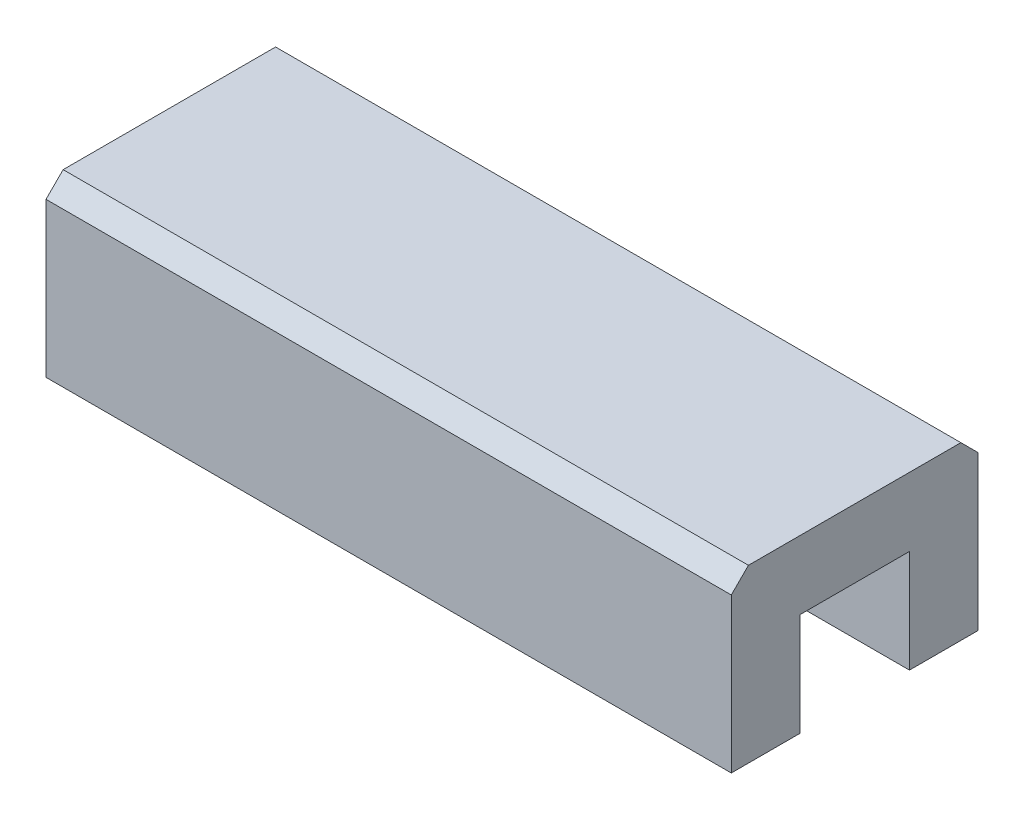
ISO-10303-21;
HEADER;
FILE_DESCRIPTION(('STEP AP214'),'2;1');
FILE_NAME('part.step','',(''),(''),'','','');
FILE_SCHEMA(('AUTOMOTIVE_DESIGN { 1 0 10303 214 1 1 1 1 }'));
ENDSEC;
DATA;
#1=APPLICATION_CONTEXT('core data for automotive mechanical design processes');
#2=APPLICATION_PROTOCOL_DEFINITION('international standard','automotive_design',2000,#1);
#3=PRODUCT_CONTEXT('',#1,'mechanical');
#4=PRODUCT('Part','Part','',(#3));
#5=PRODUCT_RELATED_PRODUCT_CATEGORY('part','',(#4));
#6=PRODUCT_DEFINITION_FORMATION('','',#4);
#7=PRODUCT_DEFINITION_CONTEXT('part definition',#1,'design');
#8=PRODUCT_DEFINITION('design','',#6,#7);
#9=PRODUCT_DEFINITION_SHAPE('','',#8);
#10=(LENGTH_UNIT() NAMED_UNIT(*) SI_UNIT(.MILLI.,.METRE.));
#11=(NAMED_UNIT(*) PLANE_ANGLE_UNIT() SI_UNIT($,.RADIAN.));
#12=(NAMED_UNIT(*) SI_UNIT($,.STERADIAN.) SOLID_ANGLE_UNIT());
#13=UNCERTAINTY_MEASURE_WITH_UNIT(LENGTH_MEASURE(1.E-05),#10,'distance_accuracy_value','');
#14=(GEOMETRIC_REPRESENTATION_CONTEXT(3) GLOBAL_UNCERTAINTY_ASSIGNED_CONTEXT((#13)) GLOBAL_UNIT_ASSIGNED_CONTEXT((#10,
#11,#12)) REPRESENTATION_CONTEXT('',''));
#15=CARTESIAN_POINT('',(0.,0.,0.));
#16=DIRECTION('',(0.,0.,1.));
#17=DIRECTION('',(1.,0.,0.));
#18=AXIS2_PLACEMENT_3D('',#15,#16,#17);
#19=CARTESIAN_POINT('',(-10.,-2.5,7.2));
#20=DIRECTION('',(0.,1.,0.));
#21=DIRECTION('',(0.,0.,1.));
#22=AXIS2_PLACEMENT_3D('',#19,#20,#21);
#23=PLANE('',#22);
#24=DIRECTION('',(0.,0.,-1.));
#25=VECTOR('',#24,1.);
#26=CARTESIAN_POINT('',(-10.,-2.5,7.2));
#27=LINE('',#26,#25);
#28=CARTESIAN_POINT('',(-10.,-2.5,7.2));
#29=VERTEX_POINT('',#28);
#30=CARTESIAN_POINT('',(-10.,-2.5,5.2));
#31=VERTEX_POINT('',#30);
#32=EDGE_CURVE('E138',#29,#31,#27,.T.);
#33=ORIENTED_EDGE('',*,*,#32,.T.);
#34=DIRECTION('',(1.,0.,0.));
#35=VECTOR('',#34,1.);
#36=CARTESIAN_POINT('',(-10.001,-2.5,5.2));
#37=LINE('',#36,#35);
#38=CARTESIAN_POINT('',(10.,-2.5,5.2));
#39=VERTEX_POINT('',#38);
#40=EDGE_CURVE('E120',#31,#39,#37,.T.);
#41=ORIENTED_EDGE('',*,*,#40,.T.);
#42=DIRECTION('',(0.,0.,-1.));
#43=VECTOR('',#42,1.);
#44=CARTESIAN_POINT('',(10.,-2.5,7.2));
#45=LINE('',#44,#43);
#46=CARTESIAN_POINT('',(10.,-2.5,7.2));
#47=VERTEX_POINT('',#46);
#48=EDGE_CURVE('E152',#47,#39,#45,.T.);
#49=ORIENTED_EDGE('',*,*,#48,.F.);
#50=DIRECTION('',(1.,0.,0.));
#51=VECTOR('',#50,1.);
#52=CARTESIAN_POINT('',(-10.,-2.5,7.2));
#53=LINE('',#52,#51);
#54=EDGE_CURVE('E144',#29,#47,#53,.T.);
#55=ORIENTED_EDGE('',*,*,#54,.F.);
#56=EDGE_LOOP('',(#33,#41,#49,#55));
#57=FACE_BOUND('',#56,.T.);
#58=ADVANCED_FACE('F41',(#57),#23,.F.);
#59=CARTESIAN_POINT('',(10.,-2.5,7.2));
#60=DIRECTION('',(-1.,0.,0.));
#61=DIRECTION('',(0.,0.,1.));
#62=AXIS2_PLACEMENT_3D('',#59,#60,#61);
#63=PLANE('',#62);
#64=DIRECTION('',(0.,0.,-1.));
#65=VECTOR('',#64,1.);
#66=CARTESIAN_POINT('',(10.,2.5,7.2));
#67=LINE('',#66,#65);
#68=CARTESIAN_POINT('',(10.,2.5,6.7));
#69=VERTEX_POINT('',#68);
#70=CARTESIAN_POINT('',(10.,2.5,0.5));
#71=VERTEX_POINT('',#70);
#72=EDGE_CURVE('E149',#69,#71,#67,.T.);
#73=ORIENTED_EDGE('',*,*,#72,.F.);
#74=DIRECTION('',(0.,0.707106781186546,-0.707106781186549));
#75=VECTOR('',#74,1.);
#76=CARTESIAN_POINT('',(10.,2.,7.2));
#77=LINE('',#76,#75);
#78=CARTESIAN_POINT('',(10.,2.,7.2));
#79=VERTEX_POINT('',#78);
#80=EDGE_CURVE('E50',#69,#79,#77,.F.);
#81=ORIENTED_EDGE('',*,*,#80,.T.);
#82=DIRECTION('',(0.,1.,0.));
#83=VECTOR('',#82,1.);
#84=CARTESIAN_POINT('',(10.,-2.5,7.2));
#85=LINE('',#84,#83);
#86=EDGE_CURVE('E173',#47,#79,#85,.T.);
#87=ORIENTED_EDGE('',*,*,#86,.F.);
#88=ORIENTED_EDGE('',*,*,#48,.T.);
#89=DIRECTION('',(0.,-1.,0.));
#90=VECTOR('',#89,1.);
#91=CARTESIAN_POINT('',(10.,-2.5,5.2));
#92=LINE('',#91,#90);
#93=CARTESIAN_POINT('',(10.,0.499999999999999,5.2));
#94=VERTEX_POINT('',#93);
#95=EDGE_CURVE('E126',#94,#39,#92,.T.);
#96=ORIENTED_EDGE('',*,*,#95,.F.);
#97=DIRECTION('',(0.,0.,1.));
#98=VECTOR('',#97,1.);
#99=CARTESIAN_POINT('',(10.,0.499999999999999,5.2));
#100=LINE('',#99,#98);
#101=CARTESIAN_POINT('',(10.,0.5,2.));
#102=VERTEX_POINT('',#101);
#103=EDGE_CURVE('E132',#102,#94,#100,.T.);
#104=ORIENTED_EDGE('',*,*,#103,.F.);
#105=DIRECTION('',(0.,1.,0.));
#106=VECTOR('',#105,1.);
#107=CARTESIAN_POINT('',(10.,-2.5,2.));
#108=LINE('',#107,#106);
#109=CARTESIAN_POINT('',(10.,-2.5,2.));
#110=VERTEX_POINT('',#109);
#111=EDGE_CURVE('E207',#110,#102,#108,.T.);
#112=ORIENTED_EDGE('',*,*,#111,.F.);
#113=CARTESIAN_POINT('',(10.,-2.5,0.));
#114=VERTEX_POINT('',#113);
#115=EDGE_CURVE('E199',#110,#114,#45,.T.);
#116=ORIENTED_EDGE('',*,*,#115,.T.);
#117=DIRECTION('',(0.,1.,0.));
#118=VECTOR('',#117,1.);
#119=CARTESIAN_POINT('',(10.,-2.5,0.));
#120=LINE('',#119,#118);
#121=CARTESIAN_POINT('',(10.,2.,0.));
#122=VERTEX_POINT('',#121);
#123=EDGE_CURVE('E193',#114,#122,#120,.T.);
#124=ORIENTED_EDGE('',*,*,#123,.T.);
#125=DIRECTION('',(0.,0.707106781186549,0.707106781186546));
#126=VECTOR('',#125,1.);
#127=CARTESIAN_POINT('',(10.,2.5,0.5));
#128=LINE('',#127,#126);
#129=EDGE_CURVE('E62',#122,#71,#128,.T.);
#130=ORIENTED_EDGE('',*,*,#129,.T.);
#131=EDGE_LOOP('',(#73,#81,#87,#88,#96,#104,#112,#116,#124,#130));
#132=FACE_BOUND('',#131,.T.);
#133=ADVANCED_FACE('F172',(#132),#63,.F.);
#134=CARTESIAN_POINT('',(-10.,2.5,7.2));
#135=DIRECTION('',(0.,-1.,0.));
#136=DIRECTION('',(0.,0.,-1.));
#137=AXIS2_PLACEMENT_3D('',#134,#135,#136);
#138=PLANE('',#137);
#139=DIRECTION('',(0.,0.,-1.));
#140=VECTOR('',#139,1.);
#141=CARTESIAN_POINT('',(-10.,2.5,7.2));
#142=LINE('',#141,#140);
#143=CARTESIAN_POINT('',(-10.,2.5,6.7));
#144=VERTEX_POINT('',#143);
#145=CARTESIAN_POINT('',(-10.,2.5,0.5));
#146=VERTEX_POINT('',#145);
#147=EDGE_CURVE('E145',#144,#146,#142,.T.);
#148=ORIENTED_EDGE('',*,*,#147,.F.);
#149=DIRECTION('',(1.,0.,0.));
#150=VECTOR('',#149,1.);
#151=CARTESIAN_POINT('',(-10.,2.5,6.7));
#152=LINE('',#151,#150);
#153=EDGE_CURVE('E167',#144,#69,#152,.T.);
#154=ORIENTED_EDGE('',*,*,#153,.T.);
#155=ORIENTED_EDGE('',*,*,#72,.T.);
#156=DIRECTION('',(-1.,0.,0.));
#157=VECTOR('',#156,1.);
#158=CARTESIAN_POINT('',(-10.,2.5,0.5));
#159=LINE('',#158,#157);
#160=EDGE_CURVE('E164',#71,#146,#159,.T.);
#161=ORIENTED_EDGE('',*,*,#160,.T.);
#162=EDGE_LOOP('',(#148,#154,#155,#161));
#163=FACE_BOUND('',#162,.T.);
#164=ADVANCED_FACE('F185',(#163),#138,.F.);
#165=CARTESIAN_POINT('',(-10.,-2.5,7.2));
#166=DIRECTION('',(1.,0.,0.));
#167=DIRECTION('',(0.,0.,-1.));
#168=AXIS2_PLACEMENT_3D('',#165,#166,#167);
#169=PLANE('',#168);
#170=DIRECTION('',(0.,-1.,0.));
#171=VECTOR('',#170,1.);
#172=CARTESIAN_POINT('',(-10.,-2.5,7.2));
#173=LINE('',#172,#171);
#174=CARTESIAN_POINT('',(-10.,2.,7.2));
#175=VERTEX_POINT('',#174);
#176=EDGE_CURVE('E179',#175,#29,#173,.T.);
#177=ORIENTED_EDGE('',*,*,#176,.F.);
#178=DIRECTION('',(0.,-0.707106781186546,0.707106781186549));
#179=VECTOR('',#178,1.);
#180=CARTESIAN_POINT('',(-10.,2.,7.2));
#181=LINE('',#180,#179);
#182=EDGE_CURVE('E162',#175,#144,#181,.F.);
#183=ORIENTED_EDGE('',*,*,#182,.T.);
#184=ORIENTED_EDGE('',*,*,#147,.T.);
#185=DIRECTION('',(0.,-0.707106781186549,-0.707106781186546));
#186=VECTOR('',#185,1.);
#187=CARTESIAN_POINT('',(-10.,2.5,0.5));
#188=LINE('',#187,#186);
#189=CARTESIAN_POINT('',(-10.,2.,0.));
#190=VERTEX_POINT('',#189);
#191=EDGE_CURVE('E160',#146,#190,#188,.T.);
#192=ORIENTED_EDGE('',*,*,#191,.T.);
#193=DIRECTION('',(0.,-1.,0.));
#194=VECTOR('',#193,1.);
#195=CARTESIAN_POINT('',(-10.,-2.5,0.));
#196=LINE('',#195,#194);
#197=CARTESIAN_POINT('',(-10.,-2.5,0.));
#198=VERTEX_POINT('',#197);
#199=EDGE_CURVE('E189',#190,#198,#196,.T.);
#200=ORIENTED_EDGE('',*,*,#199,.T.);
#201=CARTESIAN_POINT('',(-10.,-2.5,2.));
#202=VERTEX_POINT('',#201);
#203=EDGE_CURVE('E146',#202,#198,#27,.T.);
#204=ORIENTED_EDGE('',*,*,#203,.F.);
#205=DIRECTION('',(0.,-1.,0.));
#206=VECTOR('',#205,1.);
#207=CARTESIAN_POINT('',(-10.,-2.5,2.));
#208=LINE('',#207,#206);
#209=CARTESIAN_POINT('',(-10.,0.5,2.));
#210=VERTEX_POINT('',#209);
#211=EDGE_CURVE('E212',#210,#202,#208,.T.);
#212=ORIENTED_EDGE('',*,*,#211,.F.);
#213=DIRECTION('',(0.,0.,-1.));
#214=VECTOR('',#213,1.);
#215=CARTESIAN_POINT('',(-10.,0.499999999999999,5.2));
#216=LINE('',#215,#214);
#217=CARTESIAN_POINT('',(-10.,0.499999999999999,5.2));
#218=VERTEX_POINT('',#217);
#219=EDGE_CURVE('E142',#218,#210,#216,.T.);
#220=ORIENTED_EDGE('',*,*,#219,.F.);
#221=DIRECTION('',(0.,1.,0.));
#222=VECTOR('',#221,1.);
#223=CARTESIAN_POINT('',(-10.,-2.5,5.2));
#224=LINE('',#223,#222);
#225=EDGE_CURVE('E123',#31,#218,#224,.T.);
#226=ORIENTED_EDGE('',*,*,#225,.F.);
#227=ORIENTED_EDGE('',*,*,#32,.F.);
#228=EDGE_LOOP('',(#177,#183,#184,#192,#200,#204,#212,#220,#226,#227));
#229=FACE_BOUND('',#228,.T.);
#230=ADVANCED_FACE('F137',(#229),#169,.F.);
#231=ORIENTED_EDGE('',*,*,#115,.F.);
#232=DIRECTION('',(1.,0.,0.));
#233=VECTOR('',#232,1.);
#234=CARTESIAN_POINT('',(-10.001,-2.5,2.));
#235=LINE('',#234,#233);
#236=EDGE_CURVE('E131',#202,#110,#235,.T.);
#237=ORIENTED_EDGE('',*,*,#236,.F.);
#238=ORIENTED_EDGE('',*,*,#203,.T.);
#239=DIRECTION('',(1.,0.,0.));
#240=VECTOR('',#239,1.);
#241=CARTESIAN_POINT('',(-10.,-2.5,0.));
#242=LINE('',#241,#240);
#243=EDGE_CURVE('E180',#198,#114,#242,.T.);
#244=ORIENTED_EDGE('',*,*,#243,.T.);
#245=EDGE_LOOP('',(#231,#237,#238,#244));
#246=FACE_BOUND('',#245,.T.);
#247=ADVANCED_FACE('F219',(#246),#23,.F.);
#248=CARTESIAN_POINT('',(0.,0.,7.2));
#249=DIRECTION('',(0.,0.,-1.));
#250=DIRECTION('',(-1.,0.,0.));
#251=AXIS2_PLACEMENT_3D('',#248,#249,#250);
#252=PLANE('',#251);
#253=ORIENTED_EDGE('',*,*,#86,.T.);
#254=DIRECTION('',(-1.,0.,0.));
#255=VECTOR('',#254,1.);
#256=CARTESIAN_POINT('',(0.,2.,7.2));
#257=LINE('',#256,#255);
#258=EDGE_CURVE('E157',#79,#175,#257,.T.);
#259=ORIENTED_EDGE('',*,*,#258,.T.);
#260=ORIENTED_EDGE('',*,*,#176,.T.);
#261=ORIENTED_EDGE('',*,*,#54,.T.);
#262=EDGE_LOOP('',(#253,#259,#260,#261));
#263=FACE_BOUND('',#262,.T.);
#264=ADVANCED_FACE('F178',(#263),#252,.F.);
#265=CARTESIAN_POINT('',(0.,0.,0.));
#266=DIRECTION('',(0.,0.,-1.));
#267=DIRECTION('',(-1.,0.,0.));
#268=AXIS2_PLACEMENT_3D('',#265,#266,#267);
#269=PLANE('',#268);
#270=ORIENTED_EDGE('',*,*,#199,.F.);
#271=DIRECTION('',(1.,0.,0.));
#272=VECTOR('',#271,1.);
#273=CARTESIAN_POINT('',(10.,2.,0.));
#274=LINE('',#273,#272);
#275=EDGE_CURVE('E11',#190,#122,#274,.T.);
#276=ORIENTED_EDGE('',*,*,#275,.T.);
#277=ORIENTED_EDGE('',*,*,#123,.F.);
#278=ORIENTED_EDGE('',*,*,#243,.F.);
#279=EDGE_LOOP('',(#270,#276,#277,#278));
#280=FACE_BOUND('',#279,.T.);
#281=ADVANCED_FACE('F191',(#280),#269,.T.);
#282=CARTESIAN_POINT('',(-10.001,-2.5,5.2));
#283=DIRECTION('',(0.,0.,1.));
#284=DIRECTION('',(1.,0.,0.));
#285=AXIS2_PLACEMENT_3D('',#282,#283,#284);
#286=PLANE('',#285);
#287=ORIENTED_EDGE('',*,*,#225,.T.);
#288=DIRECTION('',(1.,0.,0.));
#289=VECTOR('',#288,1.);
#290=CARTESIAN_POINT('',(-10.001,0.499999999999999,5.2));
#291=LINE('',#290,#289);
#292=EDGE_CURVE('E195',#218,#94,#291,.T.);
#293=ORIENTED_EDGE('',*,*,#292,.T.);
#294=ORIENTED_EDGE('',*,*,#95,.T.);
#295=ORIENTED_EDGE('',*,*,#40,.F.);
#296=EDGE_LOOP('',(#287,#293,#294,#295));
#297=FACE_BOUND('',#296,.T.);
#298=ADVANCED_FACE('F122',(#297),#286,.F.);
#299=CARTESIAN_POINT('',(-10.001,0.499999999999999,5.2));
#300=DIRECTION('',(0.,1.,0.));
#301=DIRECTION('',(0.,0.,1.));
#302=AXIS2_PLACEMENT_3D('',#299,#300,#301);
#303=PLANE('',#302);
#304=ORIENTED_EDGE('',*,*,#219,.T.);
#305=DIRECTION('',(1.,0.,0.));
#306=VECTOR('',#305,1.);
#307=CARTESIAN_POINT('',(-10.001,0.5,2.));
#308=LINE('',#307,#306);
#309=EDGE_CURVE('E202',#210,#102,#308,.T.);
#310=ORIENTED_EDGE('',*,*,#309,.T.);
#311=ORIENTED_EDGE('',*,*,#103,.T.);
#312=ORIENTED_EDGE('',*,*,#292,.F.);
#313=EDGE_LOOP('',(#304,#310,#311,#312));
#314=FACE_BOUND('',#313,.T.);
#315=ADVANCED_FACE('F222',(#314),#303,.F.);
#316=CARTESIAN_POINT('',(-10.001,-2.5,2.));
#317=DIRECTION('',(0.,0.,-1.));
#318=DIRECTION('',(0.,1.,0.));
#319=AXIS2_PLACEMENT_3D('',#316,#317,#318);
#320=PLANE('',#319);
#321=ORIENTED_EDGE('',*,*,#211,.T.);
#322=ORIENTED_EDGE('',*,*,#236,.T.);
#323=ORIENTED_EDGE('',*,*,#111,.T.);
#324=ORIENTED_EDGE('',*,*,#309,.F.);
#325=EDGE_LOOP('',(#321,#322,#323,#324));
#326=FACE_BOUND('',#325,.T.);
#327=ADVANCED_FACE('F215',(#326),#320,.F.);
#328=CARTESIAN_POINT('',(0.,2.,7.2));
#329=DIRECTION('',(0.,-0.707106781186549,-0.707106781186546));
#330=DIRECTION('',(-1.,0.,0.));
#331=AXIS2_PLACEMENT_3D('',#328,#329,#330);
#332=PLANE('',#331);
#333=ORIENTED_EDGE('',*,*,#80,.F.);
#334=ORIENTED_EDGE('',*,*,#153,.F.);
#335=ORIENTED_EDGE('',*,*,#182,.F.);
#336=ORIENTED_EDGE('',*,*,#258,.F.);
#337=EDGE_LOOP('',(#333,#334,#335,#336));
#338=FACE_BOUND('',#337,.T.);
#339=ADVANCED_FACE('F182',(#338),#332,.F.);
#340=CARTESIAN_POINT('',(-10.,2.5,0.5));
#341=DIRECTION('',(0.,0.707106781186546,-0.707106781186549));
#342=DIRECTION('',(1.,0.,0.));
#343=AXIS2_PLACEMENT_3D('',#340,#341,#342);
#344=PLANE('',#343);
#345=ORIENTED_EDGE('',*,*,#129,.F.);
#346=ORIENTED_EDGE('',*,*,#275,.F.);
#347=ORIENTED_EDGE('',*,*,#191,.F.);
#348=ORIENTED_EDGE('',*,*,#160,.F.);
#349=EDGE_LOOP('',(#345,#346,#347,#348));
#350=FACE_BOUND('',#349,.T.);
#351=ADVANCED_FACE('F44',(#350),#344,.T.);
#352=CLOSED_SHELL('',(#58,#133,#164,#230,#247,#264,#281,#298,#315,#327,#339,#351));
#353=MANIFOLD_SOLID_BREP('B2',#352);
#354=ADVANCED_BREP_SHAPE_REPRESENTATION('',(#18,#353),#14);
#355=SHAPE_DEFINITION_REPRESENTATION(#9,#354);
ENDSEC;
END-ISO-10303-21;
